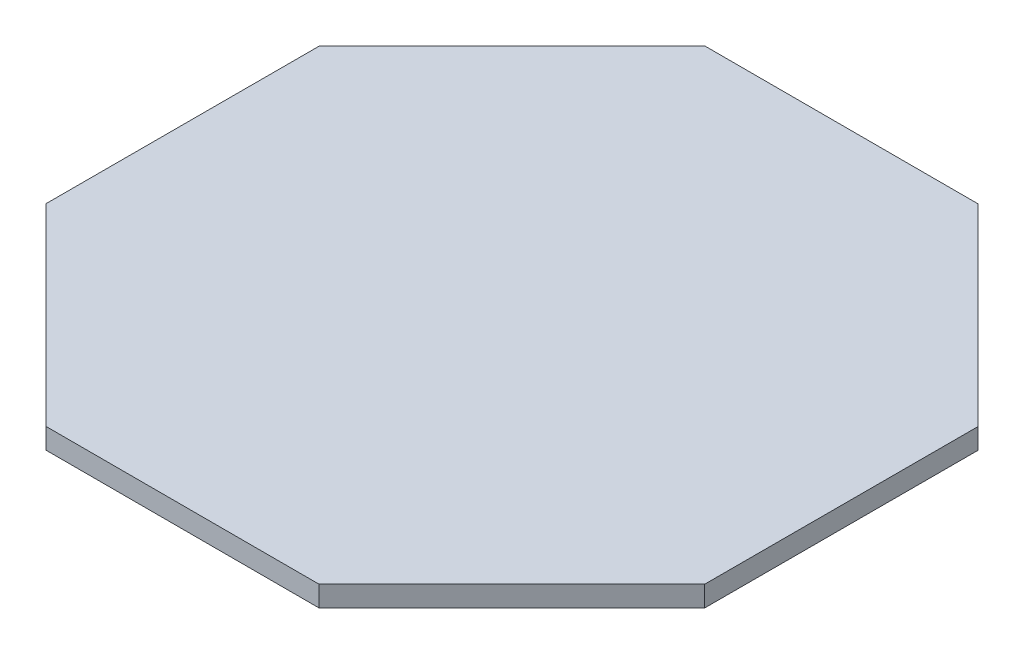
ISO-10303-21;
HEADER;
FILE_DESCRIPTION(('STEP AP214'),'2;1');
FILE_NAME('part.step','',(''),(''),'','','');
FILE_SCHEMA(('AUTOMOTIVE_DESIGN { 1 0 10303 214 1 1 1 1 }'));
ENDSEC;
DATA;
#1=APPLICATION_CONTEXT('core data for automotive mechanical design processes');
#2=APPLICATION_PROTOCOL_DEFINITION('international standard','automotive_design',2000,#1);
#3=PRODUCT_CONTEXT('',#1,'mechanical');
#4=PRODUCT('Part','Part','',(#3));
#5=PRODUCT_RELATED_PRODUCT_CATEGORY('part','',(#4));
#6=PRODUCT_DEFINITION_FORMATION('','',#4);
#7=PRODUCT_DEFINITION_CONTEXT('part definition',#1,'design');
#8=PRODUCT_DEFINITION('design','',#6,#7);
#9=PRODUCT_DEFINITION_SHAPE('','',#8);
#10=(LENGTH_UNIT() NAMED_UNIT(*) SI_UNIT(.MILLI.,.METRE.));
#11=(NAMED_UNIT(*) PLANE_ANGLE_UNIT() SI_UNIT($,.RADIAN.));
#12=(NAMED_UNIT(*) SI_UNIT($,.STERADIAN.) SOLID_ANGLE_UNIT());
#13=UNCERTAINTY_MEASURE_WITH_UNIT(LENGTH_MEASURE(1.E-05),#10,'distance_accuracy_value','');
#14=(GEOMETRIC_REPRESENTATION_CONTEXT(3) GLOBAL_UNCERTAINTY_ASSIGNED_CONTEXT((#13)) GLOBAL_UNIT_ASSIGNED_CONTEXT((#10,
#11,#12)) REPRESENTATION_CONTEXT('',''));
#15=CARTESIAN_POINT('',(0.,0.,0.));
#16=DIRECTION('',(0.,0.,1.));
#17=DIRECTION('',(1.,0.,0.));
#18=AXIS2_PLACEMENT_3D('',#15,#16,#17);
#19=CARTESIAN_POINT('',(-101.621122418852,6.35,42.0330676671659));
#20=DIRECTION('',(0.707461811080144,0.,-0.706751572947102));
#21=DIRECTION('',(-0.706751572947102,0.,-0.707461811080144));
#22=AXIS2_PLACEMENT_3D('',#19,#20,#21);
#23=PLANE('',#22);
#24=DIRECTION('',(0.706751572947102,0.,0.707461811080144));
#25=VECTOR('',#24,1.);
#26=CARTESIAN_POINT('',(-101.621122418852,0.,42.0330676671659));
#27=LINE('',#26,#25);
#28=CARTESIAN_POINT('',(-101.621122418852,0.,42.0330676671659));
#29=VERTEX_POINT('',#28);
#30=CARTESIAN_POINT('',(-42.1351175926327,0.,101.578851955685));
#31=VERTEX_POINT('',#30);
#32=EDGE_CURVE('E129',#29,#31,#27,.T.);
#33=ORIENTED_EDGE('',*,*,#32,.T.);
#34=DIRECTION('',(0.,-1.,0.));
#35=VECTOR('',#34,1.);
#36=CARTESIAN_POINT('',(-42.1351175926327,6.35,101.578851955685));
#37=LINE('',#36,#35);
#38=CARTESIAN_POINT('',(-42.1351175926327,6.35,101.578851955685));
#39=VERTEX_POINT('',#38);
#40=EDGE_CURVE('E11',#39,#31,#37,.T.);
#41=ORIENTED_EDGE('',*,*,#40,.F.);
#42=DIRECTION('',(0.706751572947102,0.,0.707461811080144));
#43=VECTOR('',#42,1.);
#44=CARTESIAN_POINT('',(-101.621122418852,6.35,42.0330676671659));
#45=LINE('',#44,#43);
#46=CARTESIAN_POINT('',(-101.621122418852,6.35,42.0330676671659));
#47=VERTEX_POINT('',#46);
#48=EDGE_CURVE('E143',#47,#39,#45,.T.);
#49=ORIENTED_EDGE('',*,*,#48,.F.);
#50=DIRECTION('',(0.,-1.,0.));
#51=VECTOR('',#50,1.);
#52=CARTESIAN_POINT('',(-101.621122418852,6.35,42.0330676671659));
#53=LINE('',#52,#51);
#54=EDGE_CURVE('E125',#47,#29,#53,.T.);
#55=ORIENTED_EDGE('',*,*,#54,.T.);
#56=EDGE_LOOP('',(#33,#41,#49,#55));
#57=FACE_BOUND('',#56,.T.);
#58=ADVANCED_FACE('F33',(#57),#23,.F.);
#59=CARTESIAN_POINT('',(-42.1351175926327,6.35,101.578851955685));
#60=DIRECTION('',(0.000502214200131599,0.,-0.999999873890441));
#61=DIRECTION('',(-0.999999873890441,0.,-0.000502214200131599));
#62=AXIS2_PLACEMENT_3D('',#59,#60,#61);
#63=PLANE('',#62);
#64=DIRECTION('',(0.999999873890441,0.,0.000502214200131599));
#65=VECTOR('',#64,1.);
#66=CARTESIAN_POINT('',(-42.1351175926327,0.,101.578851955685));
#67=LINE('',#66,#65);
#68=CARTESIAN_POINT('',(42.033067667166,0.,101.621122418852));
#69=VERTEX_POINT('',#68);
#70=EDGE_CURVE('E132',#31,#69,#67,.T.);
#71=ORIENTED_EDGE('',*,*,#70,.T.);
#72=DIRECTION('',(0.,-1.,0.));
#73=VECTOR('',#72,1.);
#74=CARTESIAN_POINT('',(42.033067667166,6.35,101.621122418852));
#75=LINE('',#74,#73);
#76=CARTESIAN_POINT('',(42.033067667166,6.35,101.621122418852));
#77=VERTEX_POINT('',#76);
#78=EDGE_CURVE('E41',#77,#69,#75,.T.);
#79=ORIENTED_EDGE('',*,*,#78,.F.);
#80=DIRECTION('',(0.999999873890441,0.,0.000502214200131599));
#81=VECTOR('',#80,1.);
#82=CARTESIAN_POINT('',(-42.1351175926327,6.35,101.578851955685));
#83=LINE('',#82,#81);
#84=EDGE_CURVE('E92',#39,#77,#83,.T.);
#85=ORIENTED_EDGE('',*,*,#84,.F.);
#86=ORIENTED_EDGE('',*,*,#40,.T.);
#87=EDGE_LOOP('',(#71,#79,#85,#86));
#88=FACE_BOUND('',#87,.T.);
#89=ADVANCED_FACE('F178',(#88),#63,.F.);
#90=CARTESIAN_POINT('',(42.033067667166,6.35,101.621122418852));
#91=DIRECTION('',(-0.706751572947101,0.,-0.707461811080144));
#92=DIRECTION('',(-0.707461811080144,0.,0.706751572947101));
#93=AXIS2_PLACEMENT_3D('',#90,#91,#92);
#94=PLANE('',#93);
#95=DIRECTION('',(0.707461811080144,0.,-0.706751572947101));
#96=VECTOR('',#95,1.);
#97=CARTESIAN_POINT('',(42.033067667166,0.,101.621122418852));
#98=LINE('',#97,#96);
#99=CARTESIAN_POINT('',(101.578851955685,0.,42.1351175926328));
#100=VERTEX_POINT('',#99);
#101=EDGE_CURVE('E134',#69,#100,#98,.T.);
#102=ORIENTED_EDGE('',*,*,#101,.T.);
#103=DIRECTION('',(0.,-1.,0.));
#104=VECTOR('',#103,1.);
#105=CARTESIAN_POINT('',(101.578851955685,6.35,42.1351175926328));
#106=LINE('',#105,#104);
#107=CARTESIAN_POINT('',(101.578851955685,6.35,42.1351175926328));
#108=VERTEX_POINT('',#107);
#109=EDGE_CURVE('E150',#108,#100,#106,.T.);
#110=ORIENTED_EDGE('',*,*,#109,.F.);
#111=DIRECTION('',(0.707461811080144,0.,-0.706751572947101));
#112=VECTOR('',#111,1.);
#113=CARTESIAN_POINT('',(42.033067667166,6.35,101.621122418852));
#114=LINE('',#113,#112);
#115=EDGE_CURVE('E158',#77,#108,#114,.T.);
#116=ORIENTED_EDGE('',*,*,#115,.F.);
#117=ORIENTED_EDGE('',*,*,#78,.T.);
#118=EDGE_LOOP('',(#102,#110,#116,#117));
#119=FACE_BOUND('',#118,.T.);
#120=ADVANCED_FACE('F156',(#119),#94,.F.);
#121=CARTESIAN_POINT('',(101.578851955685,6.35,42.1351175926328));
#122=DIRECTION('',(-0.999999873890441,0.,-0.000502214200131928));
#123=DIRECTION('',(-0.000502214200131928,0.,0.999999873890441));
#124=AXIS2_PLACEMENT_3D('',#121,#122,#123);
#125=PLANE('',#124);
#126=DIRECTION('',(0.000502214200131928,0.,-0.999999873890441));
#127=VECTOR('',#126,1.);
#128=CARTESIAN_POINT('',(101.578851955685,0.,42.1351175926328));
#129=LINE('',#128,#127);
#130=CARTESIAN_POINT('',(101.621122418853,0.,-42.033067667166));
#131=VERTEX_POINT('',#130);
#132=EDGE_CURVE('E136',#100,#131,#129,.T.);
#133=ORIENTED_EDGE('',*,*,#132,.T.);
#134=DIRECTION('',(0.,-1.,0.));
#135=VECTOR('',#134,1.);
#136=CARTESIAN_POINT('',(101.621122418853,6.35,-42.033067667166));
#137=LINE('',#136,#135);
#138=CARTESIAN_POINT('',(101.621122418853,6.35,-42.033067667166));
#139=VERTEX_POINT('',#138);
#140=EDGE_CURVE('E147',#139,#131,#137,.T.);
#141=ORIENTED_EDGE('',*,*,#140,.F.);
#142=DIRECTION('',(0.000502214200131928,0.,-0.999999873890441));
#143=VECTOR('',#142,1.);
#144=CARTESIAN_POINT('',(101.578851955685,6.35,42.1351175926328));
#145=LINE('',#144,#143);
#146=EDGE_CURVE('E170',#108,#139,#145,.T.);
#147=ORIENTED_EDGE('',*,*,#146,.F.);
#148=ORIENTED_EDGE('',*,*,#109,.T.);
#149=EDGE_LOOP('',(#133,#141,#147,#148));
#150=FACE_BOUND('',#149,.T.);
#151=ADVANCED_FACE('F166',(#150),#125,.F.);
#152=CARTESIAN_POINT('',(101.621122418853,6.35,-42.033067667166));
#153=DIRECTION('',(-0.707461811080144,0.,0.706751572947102));
#154=DIRECTION('',(0.706751572947102,0.,0.707461811080144));
#155=AXIS2_PLACEMENT_3D('',#152,#153,#154);
#156=PLANE('',#155);
#157=DIRECTION('',(-0.706751572947102,0.,-0.707461811080144));
#158=VECTOR('',#157,1.);
#159=CARTESIAN_POINT('',(101.621122418853,0.,-42.033067667166));
#160=LINE('',#159,#158);
#161=CARTESIAN_POINT('',(42.1351175926328,0.,-101.578851955685));
#162=VERTEX_POINT('',#161);
#163=EDGE_CURVE('E138',#131,#162,#160,.T.);
#164=ORIENTED_EDGE('',*,*,#163,.T.);
#165=DIRECTION('',(0.,-1.,0.));
#166=VECTOR('',#165,1.);
#167=CARTESIAN_POINT('',(42.1351175926328,6.35,-101.578851955685));
#168=LINE('',#167,#166);
#169=CARTESIAN_POINT('',(42.1351175926328,6.35,-101.578851955685));
#170=VERTEX_POINT('',#169);
#171=EDGE_CURVE('E120',#170,#162,#168,.T.);
#172=ORIENTED_EDGE('',*,*,#171,.F.);
#173=DIRECTION('',(-0.706751572947102,0.,-0.707461811080144));
#174=VECTOR('',#173,1.);
#175=CARTESIAN_POINT('',(101.621122418853,6.35,-42.033067667166));
#176=LINE('',#175,#174);
#177=EDGE_CURVE('E111',#139,#170,#176,.T.);
#178=ORIENTED_EDGE('',*,*,#177,.F.);
#179=ORIENTED_EDGE('',*,*,#140,.T.);
#180=EDGE_LOOP('',(#164,#172,#178,#179));
#181=FACE_BOUND('',#180,.T.);
#182=ADVANCED_FACE('F169',(#181),#156,.F.);
#183=CARTESIAN_POINT('',(42.1351175926328,6.35,-101.578851955685));
#184=DIRECTION('',(-0.000502214200131598,0.,0.999999873890441));
#185=DIRECTION('',(0.999999873890441,0.,0.000502214200131598));
#186=AXIS2_PLACEMENT_3D('',#183,#184,#185);
#187=PLANE('',#186);
#188=DIRECTION('',(-0.999999873890441,0.,-0.000502214200131598));
#189=VECTOR('',#188,1.);
#190=CARTESIAN_POINT('',(42.1351175926328,0.,-101.578851955685));
#191=LINE('',#190,#189);
#192=CARTESIAN_POINT('',(-42.033067667166,0.,-101.621122418853));
#193=VERTEX_POINT('',#192);
#194=EDGE_CURVE('E119',#162,#193,#191,.T.);
#195=ORIENTED_EDGE('',*,*,#194,.T.);
#196=DIRECTION('',(0.,-1.,0.));
#197=VECTOR('',#196,1.);
#198=CARTESIAN_POINT('',(-42.033067667166,6.35,-101.621122418853));
#199=LINE('',#198,#197);
#200=CARTESIAN_POINT('',(-42.033067667166,6.35,-101.621122418853));
#201=VERTEX_POINT('',#200);
#202=EDGE_CURVE('E116',#201,#193,#199,.T.);
#203=ORIENTED_EDGE('',*,*,#202,.F.);
#204=DIRECTION('',(-0.999999873890441,0.,-0.000502214200131598));
#205=VECTOR('',#204,1.);
#206=CARTESIAN_POINT('',(42.1351175926328,6.35,-101.578851955685));
#207=LINE('',#206,#205);
#208=EDGE_CURVE('E105',#170,#201,#207,.T.);
#209=ORIENTED_EDGE('',*,*,#208,.F.);
#210=ORIENTED_EDGE('',*,*,#171,.T.);
#211=EDGE_LOOP('',(#195,#203,#209,#210));
#212=FACE_BOUND('',#211,.T.);
#213=ADVANCED_FACE('F117',(#212),#187,.F.);
#214=CARTESIAN_POINT('',(-42.033067667166,6.35,-101.621122418853));
#215=DIRECTION('',(0.706751572947102,0.,0.707461811080144));
#216=DIRECTION('',(0.707461811080144,0.,-0.706751572947102));
#217=AXIS2_PLACEMENT_3D('',#214,#215,#216);
#218=PLANE('',#217);
#219=DIRECTION('',(-0.707461811080144,0.,0.706751572947101));
#220=VECTOR('',#219,1.);
#221=CARTESIAN_POINT('',(-42.033067667166,0.,-101.621122418853));
#222=LINE('',#221,#220);
#223=CARTESIAN_POINT('',(-101.578851955685,0.,-42.1351175926328));
#224=VERTEX_POINT('',#223);
#225=EDGE_CURVE('E78',#193,#224,#222,.T.);
#226=ORIENTED_EDGE('',*,*,#225,.T.);
#227=DIRECTION('',(0.,-1.,0.));
#228=VECTOR('',#227,1.);
#229=CARTESIAN_POINT('',(-101.578851955685,6.35,-42.1351175926328));
#230=LINE('',#229,#228);
#231=CARTESIAN_POINT('',(-101.578851955685,6.35,-42.1351175926328));
#232=VERTEX_POINT('',#231);
#233=EDGE_CURVE('E121',#232,#224,#230,.T.);
#234=ORIENTED_EDGE('',*,*,#233,.F.);
#235=DIRECTION('',(-0.707461811080144,0.,0.706751572947101));
#236=VECTOR('',#235,1.);
#237=CARTESIAN_POINT('',(-42.033067667166,6.35,-101.621122418853));
#238=LINE('',#237,#236);
#239=EDGE_CURVE('E109',#201,#232,#238,.T.);
#240=ORIENTED_EDGE('',*,*,#239,.F.);
#241=ORIENTED_EDGE('',*,*,#202,.T.);
#242=EDGE_LOOP('',(#226,#234,#240,#241));
#243=FACE_BOUND('',#242,.T.);
#244=ADVANCED_FACE('F123',(#243),#218,.F.);
#245=CARTESIAN_POINT('',(-101.578851955685,6.35,-42.1351175926328));
#246=DIRECTION('',(0.999999873890441,0.,0.000502214200131433));
#247=DIRECTION('',(0.000502214200131434,0.,-0.999999873890441));
#248=AXIS2_PLACEMENT_3D('',#245,#246,#247);
#249=PLANE('',#248);
#250=DIRECTION('',(-0.000502214200131434,0.,0.999999873890441));
#251=VECTOR('',#250,1.);
#252=CARTESIAN_POINT('',(-101.578851955685,0.,-42.1351175926328));
#253=LINE('',#252,#251);
#254=EDGE_CURVE('E84',#224,#29,#253,.T.);
#255=ORIENTED_EDGE('',*,*,#254,.T.);
#256=ORIENTED_EDGE('',*,*,#54,.F.);
#257=DIRECTION('',(-0.000502214200131434,0.,0.999999873890441));
#258=VECTOR('',#257,1.);
#259=CARTESIAN_POINT('',(-101.578851955685,6.35,-42.1351175926328));
#260=LINE('',#259,#258);
#261=EDGE_CURVE('E49',#232,#47,#260,.T.);
#262=ORIENTED_EDGE('',*,*,#261,.F.);
#263=ORIENTED_EDGE('',*,*,#233,.T.);
#264=EDGE_LOOP('',(#255,#256,#262,#263));
#265=FACE_BOUND('',#264,.T.);
#266=ADVANCED_FACE('F194',(#265),#249,.F.);
#267=CARTESIAN_POINT('',(0.,6.35,0.));
#268=DIRECTION('',(0.,1.,0.));
#269=DIRECTION('',(0.,0.,1.));
#270=AXIS2_PLACEMENT_3D('',#267,#268,#269);
#271=PLANE('',#270);
#272=ORIENTED_EDGE('',*,*,#48,.T.);
#273=ORIENTED_EDGE('',*,*,#84,.T.);
#274=ORIENTED_EDGE('',*,*,#115,.T.);
#275=ORIENTED_EDGE('',*,*,#146,.T.);
#276=ORIENTED_EDGE('',*,*,#177,.T.);
#277=ORIENTED_EDGE('',*,*,#208,.T.);
#278=ORIENTED_EDGE('',*,*,#239,.T.);
#279=ORIENTED_EDGE('',*,*,#261,.T.);
#280=EDGE_LOOP('',(#272,#273,#274,#275,#276,#277,#278,#279));
#281=FACE_BOUND('',#280,.T.);
#282=ADVANCED_FACE('F107',(#281),#271,.T.);
#283=CARTESIAN_POINT('',(0.,0.,0.));
#284=DIRECTION('',(0.,1.,0.));
#285=DIRECTION('',(0.,0.,1.));
#286=AXIS2_PLACEMENT_3D('',#283,#284,#285);
#287=PLANE('',#286);
#288=ORIENTED_EDGE('',*,*,#32,.F.);
#289=ORIENTED_EDGE('',*,*,#254,.F.);
#290=ORIENTED_EDGE('',*,*,#225,.F.);
#291=ORIENTED_EDGE('',*,*,#194,.F.);
#292=ORIENTED_EDGE('',*,*,#163,.F.);
#293=ORIENTED_EDGE('',*,*,#132,.F.);
#294=ORIENTED_EDGE('',*,*,#101,.F.);
#295=ORIENTED_EDGE('',*,*,#70,.F.);
#296=EDGE_LOOP('',(#288,#289,#290,#291,#292,#293,#294,#295));
#297=FACE_BOUND('',#296,.T.);
#298=ADVANCED_FACE('F162',(#297),#287,.F.);
#299=CLOSED_SHELL('',(#58,#89,#120,#151,#182,#213,#244,#266,#282,#298));
#300=MANIFOLD_SOLID_BREP('B2',#299);
#301=ADVANCED_BREP_SHAPE_REPRESENTATION('',(#18,#300),#14);
#302=SHAPE_DEFINITION_REPRESENTATION(#9,#301);
ENDSEC;
END-ISO-10303-21;
